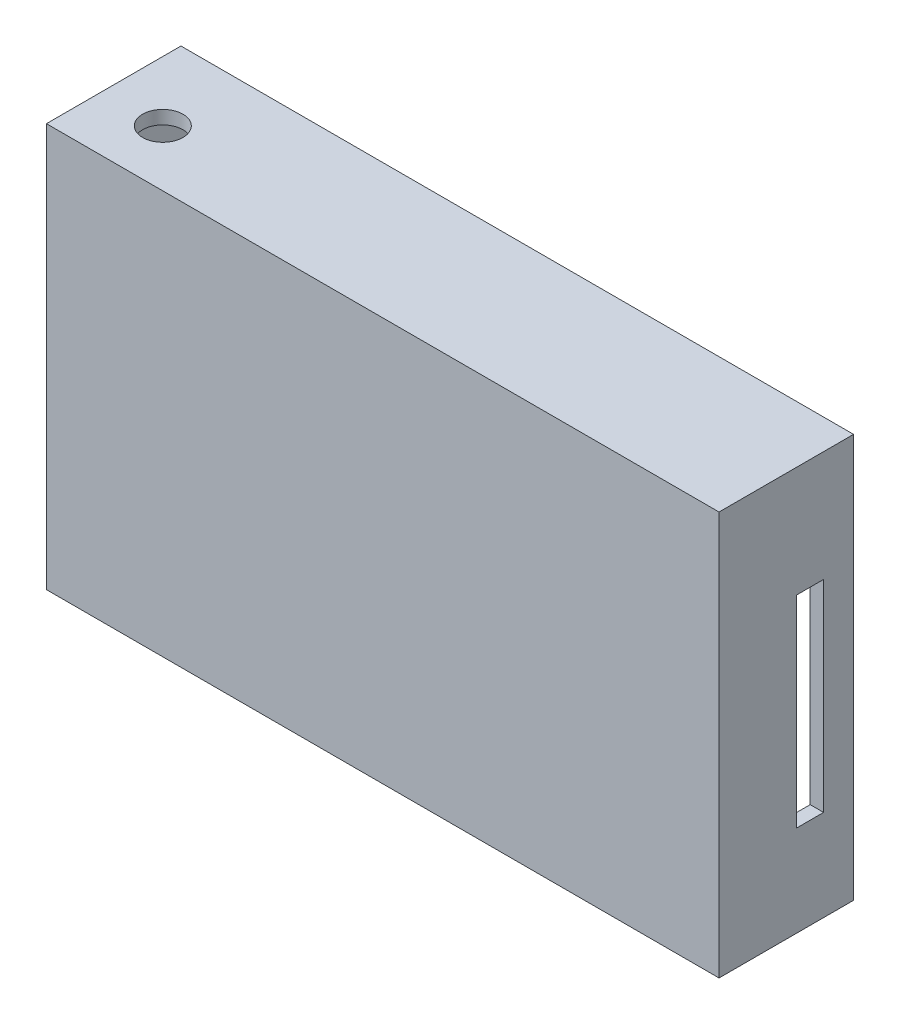
ISO-10303-21;
HEADER;
FILE_DESCRIPTION(('STEP AP214'),'2;1');
FILE_NAME('part.step','',(''),(''),'','','');
FILE_SCHEMA(('AUTOMOTIVE_DESIGN { 1 0 10303 214 1 1 1 1 }'));
ENDSEC;
DATA;
#1=APPLICATION_CONTEXT('core data for automotive mechanical design processes');
#2=APPLICATION_PROTOCOL_DEFINITION('international standard','automotive_design',2000,#1);
#3=PRODUCT_CONTEXT('',#1,'mechanical');
#4=PRODUCT('Part','Part','',(#3));
#5=PRODUCT_RELATED_PRODUCT_CATEGORY('part','',(#4));
#6=PRODUCT_DEFINITION_FORMATION('','',#4);
#7=PRODUCT_DEFINITION_CONTEXT('part definition',#1,'design');
#8=PRODUCT_DEFINITION('design','',#6,#7);
#9=PRODUCT_DEFINITION_SHAPE('','',#8);
#10=(LENGTH_UNIT() NAMED_UNIT(*) SI_UNIT(.MILLI.,.METRE.));
#11=(NAMED_UNIT(*) PLANE_ANGLE_UNIT() SI_UNIT($,.RADIAN.));
#12=(NAMED_UNIT(*) SI_UNIT($,.STERADIAN.) SOLID_ANGLE_UNIT());
#13=UNCERTAINTY_MEASURE_WITH_UNIT(LENGTH_MEASURE(1.E-05),#10,'distance_accuracy_value','');
#14=(GEOMETRIC_REPRESENTATION_CONTEXT(3) GLOBAL_UNCERTAINTY_ASSIGNED_CONTEXT((#13)) GLOBAL_UNIT_ASSIGNED_CONTEXT((#10,
#11,#12)) REPRESENTATION_CONTEXT('',''));
#15=CARTESIAN_POINT('',(0.,0.,0.));
#16=DIRECTION('',(0.,0.,1.));
#17=DIRECTION('',(1.,0.,0.));
#18=AXIS2_PLACEMENT_3D('',#15,#16,#17);
#19=CARTESIAN_POINT('',(25.,15.,10.));
#20=DIRECTION('',(-1.,0.,0.));
#21=DIRECTION('',(0.,0.,1.));
#22=AXIS2_PLACEMENT_3D('',#19,#20,#21);
#23=PLANE('',#22);
#24=DIRECTION('',(0.,0.,-1.));
#25=VECTOR('',#24,1.);
#26=CARTESIAN_POINT('',(25.,6.77303773797888,10.));
#27=LINE('',#26,#25);
#28=CARTESIAN_POINT('',(25.,6.77303773797888,4.22599338687957));
#29=VERTEX_POINT('',#28);
#30=CARTESIAN_POINT('',(25.,6.77303773797888,2.22599338687957));
#31=VERTEX_POINT('',#30);
#32=EDGE_CURVE('E189',#29,#31,#27,.T.);
#33=ORIENTED_EDGE('',*,*,#32,.T.);
#34=DIRECTION('',(0.,-1.,0.));
#35=VECTOR('',#34,1.);
#36=CARTESIAN_POINT('',(25.,15.,2.22599338687957));
#37=LINE('',#36,#35);
#38=CARTESIAN_POINT('',(25.,-8.22696226202112,2.22599338687956));
#39=VERTEX_POINT('',#38);
#40=EDGE_CURVE('E205',#31,#39,#37,.T.);
#41=ORIENTED_EDGE('',*,*,#40,.T.);
#42=DIRECTION('',(0.,0.,1.));
#43=VECTOR('',#42,1.);
#44=CARTESIAN_POINT('',(25.,-8.22696226202112,10.));
#45=LINE('',#44,#43);
#46=CARTESIAN_POINT('',(25.,-8.22696226202112,4.22599338687956));
#47=VERTEX_POINT('',#46);
#48=EDGE_CURVE('E200',#39,#47,#45,.T.);
#49=ORIENTED_EDGE('',*,*,#48,.T.);
#50=DIRECTION('',(0.,1.,0.));
#51=VECTOR('',#50,1.);
#52=CARTESIAN_POINT('',(25.,15.,4.22599338687957));
#53=LINE('',#52,#51);
#54=EDGE_CURVE('E195',#47,#29,#53,.T.);
#55=ORIENTED_EDGE('',*,*,#54,.T.);
#56=EDGE_LOOP('',(#33,#41,#49,#55));
#57=FACE_BOUND('',#56,.T.);
#58=DIRECTION('',(0.,1.,0.));
#59=VECTOR('',#58,1.);
#60=CARTESIAN_POINT('',(25.,15.,0.));
#61=LINE('',#60,#59);
#62=CARTESIAN_POINT('',(25.,-15.,0.));
#63=VERTEX_POINT('',#62);
#64=CARTESIAN_POINT('',(25.,15.,0.));
#65=VERTEX_POINT('',#64);
#66=EDGE_CURVE('E212',#63,#65,#61,.T.);
#67=ORIENTED_EDGE('',*,*,#66,.T.);
#68=DIRECTION('',(0.,0.,-1.));
#69=VECTOR('',#68,1.);
#70=CARTESIAN_POINT('',(25.,15.,10.));
#71=LINE('',#70,#69);
#72=CARTESIAN_POINT('',(25.,15.,10.));
#73=VERTEX_POINT('',#72);
#74=EDGE_CURVE('E266',#73,#65,#71,.T.);
#75=ORIENTED_EDGE('',*,*,#74,.F.);
#76=DIRECTION('',(0.,1.,0.));
#77=VECTOR('',#76,1.);
#78=CARTESIAN_POINT('',(25.,15.,10.));
#79=LINE('',#78,#77);
#80=CARTESIAN_POINT('',(25.,-15.,10.));
#81=VERTEX_POINT('',#80);
#82=EDGE_CURVE('E240',#81,#73,#79,.T.);
#83=ORIENTED_EDGE('',*,*,#82,.F.);
#84=DIRECTION('',(0.,0.,-1.));
#85=VECTOR('',#84,1.);
#86=CARTESIAN_POINT('',(25.,-15.,10.));
#87=LINE('',#86,#85);
#88=EDGE_CURVE('E250',#81,#63,#87,.T.);
#89=ORIENTED_EDGE('',*,*,#88,.T.);
#90=EDGE_LOOP('',(#67,#75,#83,#89));
#91=FACE_BOUND('',#90,.T.);
#92=ADVANCED_FACE('F37',(#57,#91),#23,.F.);
#93=CARTESIAN_POINT('',(-25.,15.,10.));
#94=DIRECTION('',(0.,-1.,0.));
#95=DIRECTION('',(0.,0.,-1.));
#96=AXIS2_PLACEMENT_3D('',#93,#94,#95);
#97=PLANE('',#96);
#98=CARTESIAN_POINT('',(-20.5348885491573,15.,5.81535586886346));
#99=DIRECTION('',(0.,-1.,0.));
#100=DIRECTION('',(0.,0.,-1.));
#101=AXIS2_PLACEMENT_3D('',#98,#99,#100);
#102=CIRCLE('',#101,1.5);
#103=CARTESIAN_POINT('',(-20.5348885491573,15.,4.31535586886346));
#104=VERTEX_POINT('',#103);
#105=EDGE_CURVE('E172',#104,#104,#102,.T.);
#106=ORIENTED_EDGE('',*,*,#105,.T.);
#107=EDGE_LOOP('',(#106));
#108=FACE_BOUND('',#107,.T.);
#109=DIRECTION('',(-1.,0.,0.));
#110=VECTOR('',#109,1.);
#111=CARTESIAN_POINT('',(-25.,15.,0.));
#112=LINE('',#111,#110);
#113=CARTESIAN_POINT('',(-25.,15.,0.));
#114=VERTEX_POINT('',#113);
#115=EDGE_CURVE('E253',#65,#114,#112,.T.);
#116=ORIENTED_EDGE('',*,*,#115,.T.);
#117=DIRECTION('',(0.,0.,-1.));
#118=VECTOR('',#117,1.);
#119=CARTESIAN_POINT('',(-25.,15.,10.));
#120=LINE('',#119,#118);
#121=CARTESIAN_POINT('',(-25.,15.,10.));
#122=VERTEX_POINT('',#121);
#123=EDGE_CURVE('E263',#122,#114,#120,.T.);
#124=ORIENTED_EDGE('',*,*,#123,.F.);
#125=DIRECTION('',(-1.,0.,0.));
#126=VECTOR('',#125,1.);
#127=CARTESIAN_POINT('',(-25.,15.,10.));
#128=LINE('',#127,#126);
#129=EDGE_CURVE('E243',#73,#122,#128,.T.);
#130=ORIENTED_EDGE('',*,*,#129,.F.);
#131=ORIENTED_EDGE('',*,*,#74,.T.);
#132=EDGE_LOOP('',(#116,#124,#130,#131));
#133=FACE_BOUND('',#132,.T.);
#134=ADVANCED_FACE('F296',(#108,#133),#97,.F.);
#135=CARTESIAN_POINT('',(-25.,15.,10.));
#136=DIRECTION('',(1.,0.,0.));
#137=DIRECTION('',(0.,1.,0.));
#138=AXIS2_PLACEMENT_3D('',#135,#136,#137);
#139=PLANE('',#138);
#140=DIRECTION('',(0.,0.,-1.));
#141=VECTOR('',#140,1.);
#142=CARTESIAN_POINT('',(-25.,-8.22696226202112,4.22599338687956));
#143=LINE('',#142,#141);
#144=CARTESIAN_POINT('',(-25.,-8.22696226202112,4.22599338687956));
#145=VERTEX_POINT('',#144);
#146=CARTESIAN_POINT('',(-25.,-8.22696226202112,2.22599338687956));
#147=VERTEX_POINT('',#146);
#148=EDGE_CURVE('E171',#145,#147,#143,.T.);
#149=ORIENTED_EDGE('',*,*,#148,.T.);
#150=DIRECTION('',(0.,1.,0.));
#151=VECTOR('',#150,1.);
#152=CARTESIAN_POINT('',(-25.,6.77303773797888,2.22599338687957));
#153=LINE('',#152,#151);
#154=CARTESIAN_POINT('',(-25.,6.77303773797888,2.22599338687957));
#155=VERTEX_POINT('',#154);
#156=EDGE_CURVE('E155',#147,#155,#153,.T.);
#157=ORIENTED_EDGE('',*,*,#156,.T.);
#158=DIRECTION('',(0.,0.,1.));
#159=VECTOR('',#158,1.);
#160=CARTESIAN_POINT('',(-25.,6.77303773797888,4.22599338687957));
#161=LINE('',#160,#159);
#162=CARTESIAN_POINT('',(-25.,6.77303773797888,4.22599338687957));
#163=VERTEX_POINT('',#162);
#164=EDGE_CURVE('E163',#155,#163,#161,.T.);
#165=ORIENTED_EDGE('',*,*,#164,.T.);
#166=DIRECTION('',(0.,-1.,0.));
#167=VECTOR('',#166,1.);
#168=CARTESIAN_POINT('',(-25.,6.77303773797888,4.22599338687957));
#169=LINE('',#168,#167);
#170=EDGE_CURVE('E60',#163,#145,#169,.T.);
#171=ORIENTED_EDGE('',*,*,#170,.T.);
#172=EDGE_LOOP('',(#149,#157,#165,#171));
#173=FACE_BOUND('',#172,.T.);
#174=DIRECTION('',(0.,-1.,0.));
#175=VECTOR('',#174,1.);
#176=CARTESIAN_POINT('',(-25.,15.,0.));
#177=LINE('',#176,#175);
#178=CARTESIAN_POINT('',(-25.,-15.,0.));
#179=VERTEX_POINT('',#178);
#180=EDGE_CURVE('E255',#114,#179,#177,.T.);
#181=ORIENTED_EDGE('',*,*,#180,.T.);
#182=DIRECTION('',(0.,0.,-1.));
#183=VECTOR('',#182,1.);
#184=CARTESIAN_POINT('',(-25.,-15.,10.));
#185=LINE('',#184,#183);
#186=CARTESIAN_POINT('',(-25.,-15.,10.));
#187=VERTEX_POINT('',#186);
#188=EDGE_CURVE('E260',#187,#179,#185,.T.);
#189=ORIENTED_EDGE('',*,*,#188,.F.);
#190=DIRECTION('',(0.,-1.,0.));
#191=VECTOR('',#190,1.);
#192=CARTESIAN_POINT('',(-25.,15.,10.));
#193=LINE('',#192,#191);
#194=EDGE_CURVE('E246',#122,#187,#193,.T.);
#195=ORIENTED_EDGE('',*,*,#194,.F.);
#196=ORIENTED_EDGE('',*,*,#123,.T.);
#197=EDGE_LOOP('',(#181,#189,#195,#196));
#198=FACE_BOUND('',#197,.T.);
#199=ADVANCED_FACE('F168',(#173,#198),#139,.F.);
#200=CARTESIAN_POINT('',(-25.,-15.,10.));
#201=DIRECTION('',(0.,1.,0.));
#202=DIRECTION('',(0.,0.,1.));
#203=AXIS2_PLACEMENT_3D('',#200,#201,#202);
#204=PLANE('',#203);
#205=DIRECTION('',(1.,0.,0.));
#206=VECTOR('',#205,1.);
#207=CARTESIAN_POINT('',(-25.,-15.,0.));
#208=LINE('',#207,#206);
#209=EDGE_CURVE('E244',#179,#63,#208,.T.);
#210=ORIENTED_EDGE('',*,*,#209,.T.);
#211=ORIENTED_EDGE('',*,*,#88,.F.);
#212=DIRECTION('',(1.,0.,0.));
#213=VECTOR('',#212,1.);
#214=CARTESIAN_POINT('',(-25.,-15.,10.));
#215=LINE('',#214,#213);
#216=EDGE_CURVE('E248',#187,#81,#215,.T.);
#217=ORIENTED_EDGE('',*,*,#216,.F.);
#218=ORIENTED_EDGE('',*,*,#188,.T.);
#219=EDGE_LOOP('',(#210,#211,#217,#218));
#220=FACE_BOUND('',#219,.T.);
#221=ADVANCED_FACE('F319',(#220),#204,.F.);
#222=CARTESIAN_POINT('',(0.,0.,10.));
#223=DIRECTION('',(0.,0.,1.));
#224=DIRECTION('',(1.,0.,0.));
#225=AXIS2_PLACEMENT_3D('',#222,#223,#224);
#226=PLANE('',#225);
#227=ORIENTED_EDGE('',*,*,#82,.T.);
#228=ORIENTED_EDGE('',*,*,#129,.T.);
#229=ORIENTED_EDGE('',*,*,#194,.T.);
#230=ORIENTED_EDGE('',*,*,#216,.T.);
#231=EDGE_LOOP('',(#227,#228,#229,#230));
#232=FACE_BOUND('',#231,.T.);
#233=ADVANCED_FACE('F315',(#232),#226,.T.);
#234=CARTESIAN_POINT('',(0.,0.,0.));
#235=DIRECTION('',(0.,0.,1.));
#236=DIRECTION('',(1.,0.,0.));
#237=AXIS2_PLACEMENT_3D('',#234,#235,#236);
#238=PLANE('',#237);
#239=DIRECTION('',(1.,0.,0.));
#240=VECTOR('',#239,1.);
#241=CARTESIAN_POINT('',(-25.,-14.,0.));
#242=LINE('',#241,#240);
#243=CARTESIAN_POINT('',(-24.,-14.,0.));
#244=VERTEX_POINT('',#243);
#245=CARTESIAN_POINT('',(24.,-14.,0.));
#246=VERTEX_POINT('',#245);
#247=EDGE_CURVE('E218',#244,#246,#242,.T.);
#248=ORIENTED_EDGE('',*,*,#247,.T.);
#249=DIRECTION('',(0.,1.,0.));
#250=VECTOR('',#249,1.);
#251=CARTESIAN_POINT('',(24.,15.,0.));
#252=LINE('',#251,#250);
#253=CARTESIAN_POINT('',(24.,14.,0.));
#254=VERTEX_POINT('',#253);
#255=EDGE_CURVE('E208',#246,#254,#252,.T.);
#256=ORIENTED_EDGE('',*,*,#255,.T.);
#257=DIRECTION('',(-1.,0.,0.));
#258=VECTOR('',#257,1.);
#259=CARTESIAN_POINT('',(-25.,14.,0.));
#260=LINE('',#259,#258);
#261=CARTESIAN_POINT('',(-24.,14.,0.));
#262=VERTEX_POINT('',#261);
#263=EDGE_CURVE('E232',#254,#262,#260,.T.);
#264=ORIENTED_EDGE('',*,*,#263,.T.);
#265=DIRECTION('',(0.,-1.,0.));
#266=VECTOR('',#265,1.);
#267=CARTESIAN_POINT('',(-24.,15.,0.));
#268=LINE('',#267,#266);
#269=EDGE_CURVE('E235',#262,#244,#268,.T.);
#270=ORIENTED_EDGE('',*,*,#269,.T.);
#271=EDGE_LOOP('',(#248,#256,#264,#270));
#272=FACE_BOUND('',#271,.T.);
#273=ORIENTED_EDGE('',*,*,#66,.F.);
#274=ORIENTED_EDGE('',*,*,#209,.F.);
#275=ORIENTED_EDGE('',*,*,#180,.F.);
#276=ORIENTED_EDGE('',*,*,#115,.F.);
#277=EDGE_LOOP('',(#273,#274,#275,#276));
#278=FACE_BOUND('',#277,.T.);
#279=ADVANCED_FACE('F309',(#272,#278),#238,.F.);
#280=CARTESIAN_POINT('',(24.,15.,10.));
#281=DIRECTION('',(-1.,0.,0.));
#282=DIRECTION('',(0.,0.,1.));
#283=AXIS2_PLACEMENT_3D('',#280,#281,#282);
#284=PLANE('',#283);
#285=DIRECTION('',(0.,-1.,0.));
#286=VECTOR('',#285,1.);
#287=CARTESIAN_POINT('',(24.,15.,2.22599338687957));
#288=LINE('',#287,#286);
#289=CARTESIAN_POINT('',(24.,6.77303773797888,2.22599338687957));
#290=VERTEX_POINT('',#289);
#291=CARTESIAN_POINT('',(24.,-8.22696226202112,2.22599338687956));
#292=VERTEX_POINT('',#291);
#293=EDGE_CURVE('E203',#290,#292,#288,.T.);
#294=ORIENTED_EDGE('',*,*,#293,.F.);
#295=DIRECTION('',(0.,0.,-1.));
#296=VECTOR('',#295,1.);
#297=CARTESIAN_POINT('',(24.,6.77303773797888,10.));
#298=LINE('',#297,#296);
#299=CARTESIAN_POINT('',(24.,6.77303773797888,4.22599338687957));
#300=VERTEX_POINT('',#299);
#301=EDGE_CURVE('E181',#300,#290,#298,.T.);
#302=ORIENTED_EDGE('',*,*,#301,.F.);
#303=DIRECTION('',(0.,1.,0.));
#304=VECTOR('',#303,1.);
#305=CARTESIAN_POINT('',(24.,15.,4.22599338687957));
#306=LINE('',#305,#304);
#307=CARTESIAN_POINT('',(24.,-8.22696226202112,4.22599338687956));
#308=VERTEX_POINT('',#307);
#309=EDGE_CURVE('E192',#308,#300,#306,.T.);
#310=ORIENTED_EDGE('',*,*,#309,.F.);
#311=DIRECTION('',(0.,0.,1.));
#312=VECTOR('',#311,1.);
#313=CARTESIAN_POINT('',(24.,-8.22696226202112,10.));
#314=LINE('',#313,#312);
#315=EDGE_CURVE('E198',#292,#308,#314,.T.);
#316=ORIENTED_EDGE('',*,*,#315,.F.);
#317=EDGE_LOOP('',(#294,#302,#310,#316));
#318=FACE_BOUND('',#317,.T.);
#319=ORIENTED_EDGE('',*,*,#255,.F.);
#320=DIRECTION('',(0.,0.,-1.));
#321=VECTOR('',#320,1.);
#322=CARTESIAN_POINT('',(24.,-14.,10.));
#323=LINE('',#322,#321);
#324=CARTESIAN_POINT('',(24.,-14.,9.));
#325=VERTEX_POINT('',#324);
#326=EDGE_CURVE('E219',#325,#246,#323,.T.);
#327=ORIENTED_EDGE('',*,*,#326,.F.);
#328=DIRECTION('',(0.,1.,0.));
#329=VECTOR('',#328,1.);
#330=CARTESIAN_POINT('',(24.,15.,9.));
#331=LINE('',#330,#329);
#332=CARTESIAN_POINT('',(24.,14.,9.));
#333=VERTEX_POINT('',#332);
#334=EDGE_CURVE('E214',#325,#333,#331,.T.);
#335=ORIENTED_EDGE('',*,*,#334,.T.);
#336=DIRECTION('',(0.,0.,-1.));
#337=VECTOR('',#336,1.);
#338=CARTESIAN_POINT('',(24.,14.,10.));
#339=LINE('',#338,#337);
#340=EDGE_CURVE('E209',#333,#254,#339,.T.);
#341=ORIENTED_EDGE('',*,*,#340,.T.);
#342=EDGE_LOOP('',(#319,#327,#335,#341));
#343=FACE_BOUND('',#342,.T.);
#344=ADVANCED_FACE('F329',(#318,#343),#284,.T.);
#345=CARTESIAN_POINT('',(-25.,14.,10.));
#346=DIRECTION('',(0.,-1.,0.));
#347=DIRECTION('',(0.,0.,-1.));
#348=AXIS2_PLACEMENT_3D('',#345,#346,#347);
#349=PLANE('',#348);
#350=CARTESIAN_POINT('',(-20.5348885491573,14.,5.81535586886346));
#351=DIRECTION('',(0.,-1.,0.));
#352=DIRECTION('',(0.,0.,-1.));
#353=AXIS2_PLACEMENT_3D('',#350,#351,#352);
#354=CIRCLE('',#353,1.5);
#355=CARTESIAN_POINT('',(-20.5348885491573,14.,4.31535586886346));
#356=VERTEX_POINT('',#355);
#357=EDGE_CURVE('E40',#356,#356,#354,.T.);
#358=ORIENTED_EDGE('',*,*,#357,.F.);
#359=EDGE_LOOP('',(#358));
#360=FACE_BOUND('',#359,.T.);
#361=ORIENTED_EDGE('',*,*,#263,.F.);
#362=ORIENTED_EDGE('',*,*,#340,.F.);
#363=DIRECTION('',(-1.,0.,0.));
#364=VECTOR('',#363,1.);
#365=CARTESIAN_POINT('',(-25.,14.,9.));
#366=LINE('',#365,#364);
#367=CARTESIAN_POINT('',(-24.,14.,9.));
#368=VERTEX_POINT('',#367);
#369=EDGE_CURVE('E217',#333,#368,#366,.T.);
#370=ORIENTED_EDGE('',*,*,#369,.T.);
#371=DIRECTION('',(0.,0.,-1.));
#372=VECTOR('',#371,1.);
#373=CARTESIAN_POINT('',(-24.,14.,10.));
#374=LINE('',#373,#372);
#375=EDGE_CURVE('E213',#368,#262,#374,.T.);
#376=ORIENTED_EDGE('',*,*,#375,.T.);
#377=EDGE_LOOP('',(#361,#362,#370,#376));
#378=FACE_BOUND('',#377,.T.);
#379=ADVANCED_FACE('F342',(#360,#378),#349,.T.);
#380=CARTESIAN_POINT('',(-24.,15.,10.));
#381=DIRECTION('',(1.,0.,0.));
#382=DIRECTION('',(0.,1.,0.));
#383=AXIS2_PLACEMENT_3D('',#380,#381,#382);
#384=PLANE('',#383);
#385=DIRECTION('',(0.,1.,0.));
#386=VECTOR('',#385,1.);
#387=CARTESIAN_POINT('',(-24.,15.,2.22599338687957));
#388=LINE('',#387,#386);
#389=CARTESIAN_POINT('',(-24.,-8.22696226202112,2.22599338687956));
#390=VERTEX_POINT('',#389);
#391=CARTESIAN_POINT('',(-24.,6.77303773797888,2.22599338687957));
#392=VERTEX_POINT('',#391);
#393=EDGE_CURVE('E11',#390,#392,#388,.T.);
#394=ORIENTED_EDGE('',*,*,#393,.F.);
#395=DIRECTION('',(0.,0.,-1.));
#396=VECTOR('',#395,1.);
#397=CARTESIAN_POINT('',(-24.,-8.22696226202112,10.));
#398=LINE('',#397,#396);
#399=CARTESIAN_POINT('',(-24.,-8.22696226202112,4.22599338687956));
#400=VERTEX_POINT('',#399);
#401=EDGE_CURVE('E45',#400,#390,#398,.T.);
#402=ORIENTED_EDGE('',*,*,#401,.F.);
#403=DIRECTION('',(0.,-1.,0.));
#404=VECTOR('',#403,1.);
#405=CARTESIAN_POINT('',(-24.,15.,4.22599338687957));
#406=LINE('',#405,#404);
#407=CARTESIAN_POINT('',(-24.,6.77303773797888,4.22599338687957));
#408=VERTEX_POINT('',#407);
#409=EDGE_CURVE('E271',#408,#400,#406,.T.);
#410=ORIENTED_EDGE('',*,*,#409,.F.);
#411=DIRECTION('',(0.,0.,1.));
#412=VECTOR('',#411,1.);
#413=CARTESIAN_POINT('',(-24.,6.77303773797888,10.));
#414=LINE('',#413,#412);
#415=EDGE_CURVE('E269',#392,#408,#414,.T.);
#416=ORIENTED_EDGE('',*,*,#415,.F.);
#417=EDGE_LOOP('',(#394,#402,#410,#416));
#418=FACE_BOUND('',#417,.T.);
#419=ORIENTED_EDGE('',*,*,#269,.F.);
#420=ORIENTED_EDGE('',*,*,#375,.F.);
#421=DIRECTION('',(0.,-1.,0.));
#422=VECTOR('',#421,1.);
#423=CARTESIAN_POINT('',(-24.,15.,9.));
#424=LINE('',#423,#422);
#425=CARTESIAN_POINT('',(-24.,-14.,9.));
#426=VERTEX_POINT('',#425);
#427=EDGE_CURVE('E226',#368,#426,#424,.T.);
#428=ORIENTED_EDGE('',*,*,#427,.T.);
#429=DIRECTION('',(0.,0.,-1.));
#430=VECTOR('',#429,1.);
#431=CARTESIAN_POINT('',(-24.,-14.,10.));
#432=LINE('',#431,#430);
#433=EDGE_CURVE('E221',#426,#244,#432,.T.);
#434=ORIENTED_EDGE('',*,*,#433,.T.);
#435=EDGE_LOOP('',(#419,#420,#428,#434));
#436=FACE_BOUND('',#435,.T.);
#437=ADVANCED_FACE('F278',(#418,#436),#384,.T.);
#438=CARTESIAN_POINT('',(-25.,-14.,10.));
#439=DIRECTION('',(0.,1.,0.));
#440=DIRECTION('',(0.,0.,1.));
#441=AXIS2_PLACEMENT_3D('',#438,#439,#440);
#442=PLANE('',#441);
#443=ORIENTED_EDGE('',*,*,#247,.F.);
#444=ORIENTED_EDGE('',*,*,#433,.F.);
#445=DIRECTION('',(1.,0.,0.));
#446=VECTOR('',#445,1.);
#447=CARTESIAN_POINT('',(-25.,-14.,9.));
#448=LINE('',#447,#446);
#449=EDGE_CURVE('E222',#426,#325,#448,.T.);
#450=ORIENTED_EDGE('',*,*,#449,.T.);
#451=ORIENTED_EDGE('',*,*,#326,.T.);
#452=EDGE_LOOP('',(#443,#444,#450,#451));
#453=FACE_BOUND('',#452,.T.);
#454=ADVANCED_FACE('F335',(#453),#442,.T.);
#455=CARTESIAN_POINT('',(0.,0.,9.));
#456=DIRECTION('',(0.,0.,1.));
#457=DIRECTION('',(1.,0.,0.));
#458=AXIS2_PLACEMENT_3D('',#455,#456,#457);
#459=PLANE('',#458);
#460=ORIENTED_EDGE('',*,*,#334,.F.);
#461=ORIENTED_EDGE('',*,*,#449,.F.);
#462=ORIENTED_EDGE('',*,*,#427,.F.);
#463=ORIENTED_EDGE('',*,*,#369,.F.);
#464=EDGE_LOOP('',(#460,#461,#462,#463));
#465=FACE_BOUND('',#464,.T.);
#466=ADVANCED_FACE('F290',(#465),#459,.F.);
#467=CARTESIAN_POINT('',(-25.,6.77303773797888,4.22599338687957));
#468=DIRECTION('',(0.,1.,0.));
#469=DIRECTION('',(0.,0.,1.));
#470=AXIS2_PLACEMENT_3D('',#467,#468,#469);
#471=PLANE('',#470);
#472=ORIENTED_EDGE('',*,*,#415,.T.);
#473=DIRECTION('',(1.,0.,0.));
#474=VECTOR('',#473,1.);
#475=CARTESIAN_POINT('',(-25.,6.77303773797888,4.22599338687957));
#476=LINE('',#475,#474);
#477=EDGE_CURVE('E165',#163,#408,#476,.T.);
#478=ORIENTED_EDGE('',*,*,#477,.F.);
#479=ORIENTED_EDGE('',*,*,#164,.F.);
#480=DIRECTION('',(1.,0.,0.));
#481=VECTOR('',#480,1.);
#482=CARTESIAN_POINT('',(-25.,6.77303773797888,2.22599338687957));
#483=LINE('',#482,#481);
#484=EDGE_CURVE('E150',#155,#392,#483,.T.);
#485=ORIENTED_EDGE('',*,*,#484,.T.);
#486=EDGE_LOOP('',(#472,#478,#479,#485));
#487=FACE_BOUND('',#486,.T.);
#488=ADVANCED_FACE('F164',(#487),#471,.F.);
#489=CARTESIAN_POINT('',(-25.,6.77303773797888,4.22599338687957));
#490=DIRECTION('',(0.,0.,1.));
#491=DIRECTION('',(0.,-1.,0.));
#492=AXIS2_PLACEMENT_3D('',#489,#490,#491);
#493=PLANE('',#492);
#494=ORIENTED_EDGE('',*,*,#409,.T.);
#495=DIRECTION('',(1.,0.,0.));
#496=VECTOR('',#495,1.);
#497=CARTESIAN_POINT('',(-25.,-8.22696226202112,4.22599338687956));
#498=LINE('',#497,#496);
#499=EDGE_CURVE('E183',#145,#400,#498,.T.);
#500=ORIENTED_EDGE('',*,*,#499,.F.);
#501=ORIENTED_EDGE('',*,*,#170,.F.);
#502=ORIENTED_EDGE('',*,*,#477,.T.);
#503=EDGE_LOOP('',(#494,#500,#501,#502));
#504=FACE_BOUND('',#503,.T.);
#505=ADVANCED_FACE('F280',(#504),#493,.F.);
#506=CARTESIAN_POINT('',(-25.,-8.22696226202112,4.22599338687956));
#507=DIRECTION('',(0.,-1.,0.));
#508=DIRECTION('',(0.,0.,-1.));
#509=AXIS2_PLACEMENT_3D('',#506,#507,#508);
#510=PLANE('',#509);
#511=ORIENTED_EDGE('',*,*,#401,.T.);
#512=DIRECTION('',(1.,0.,0.));
#513=VECTOR('',#512,1.);
#514=CARTESIAN_POINT('',(-25.,-8.22696226202112,2.22599338687956));
#515=LINE('',#514,#513);
#516=EDGE_CURVE('E179',#147,#390,#515,.T.);
#517=ORIENTED_EDGE('',*,*,#516,.F.);
#518=ORIENTED_EDGE('',*,*,#148,.F.);
#519=ORIENTED_EDGE('',*,*,#499,.T.);
#520=EDGE_LOOP('',(#511,#517,#518,#519));
#521=FACE_BOUND('',#520,.T.);
#522=ADVANCED_FACE('F275',(#521),#510,.F.);
#523=CARTESIAN_POINT('',(-25.,6.77303773797888,2.22599338687957));
#524=DIRECTION('',(0.,0.,-1.));
#525=DIRECTION('',(0.,1.,0.));
#526=AXIS2_PLACEMENT_3D('',#523,#524,#525);
#527=PLANE('',#526);
#528=ORIENTED_EDGE('',*,*,#393,.T.);
#529=ORIENTED_EDGE('',*,*,#484,.F.);
#530=ORIENTED_EDGE('',*,*,#156,.F.);
#531=ORIENTED_EDGE('',*,*,#516,.T.);
#532=EDGE_LOOP('',(#528,#529,#530,#531));
#533=FACE_BOUND('',#532,.T.);
#534=ADVANCED_FACE('F152',(#533),#527,.F.);
#535=EDGE_CURVE('E52',#290,#31,#483,.T.);
#536=ORIENTED_EDGE('',*,*,#535,.F.);
#537=ORIENTED_EDGE('',*,*,#293,.T.);
#538=EDGE_CURVE('E182',#292,#39,#515,.T.);
#539=ORIENTED_EDGE('',*,*,#538,.T.);
#540=ORIENTED_EDGE('',*,*,#40,.F.);
#541=EDGE_LOOP('',(#536,#537,#539,#540));
#542=FACE_BOUND('',#541,.T.);
#543=ADVANCED_FACE('F350',(#542),#527,.F.);
#544=ORIENTED_EDGE('',*,*,#538,.F.);
#545=ORIENTED_EDGE('',*,*,#315,.T.);
#546=EDGE_CURVE('E186',#308,#47,#498,.T.);
#547=ORIENTED_EDGE('',*,*,#546,.T.);
#548=ORIENTED_EDGE('',*,*,#48,.F.);
#549=EDGE_LOOP('',(#544,#545,#547,#548));
#550=FACE_BOUND('',#549,.T.);
#551=ADVANCED_FACE('F289',(#550),#510,.F.);
#552=ORIENTED_EDGE('',*,*,#546,.F.);
#553=ORIENTED_EDGE('',*,*,#309,.T.);
#554=EDGE_CURVE('E160',#300,#29,#476,.T.);
#555=ORIENTED_EDGE('',*,*,#554,.T.);
#556=ORIENTED_EDGE('',*,*,#54,.F.);
#557=EDGE_LOOP('',(#552,#553,#555,#556));
#558=FACE_BOUND('',#557,.T.);
#559=ADVANCED_FACE('F283',(#558),#493,.F.);
#560=ORIENTED_EDGE('',*,*,#554,.F.);
#561=ORIENTED_EDGE('',*,*,#301,.T.);
#562=ORIENTED_EDGE('',*,*,#535,.T.);
#563=ORIENTED_EDGE('',*,*,#32,.F.);
#564=EDGE_LOOP('',(#560,#561,#562,#563));
#565=FACE_BOUND('',#564,.T.);
#566=ADVANCED_FACE('F292',(#565),#471,.F.);
#567=CARTESIAN_POINT('',(-20.5348885491573,4.,5.81535586886346));
#568=DIRECTION('',(0.,1.,0.));
#569=DIRECTION('',(0.,0.,1.));
#570=AXIS2_PLACEMENT_3D('',#567,#568,#569);
#571=CYLINDRICAL_SURFACE('',#570,1.5);
#572=ORIENTED_EDGE('',*,*,#357,.T.);
#573=EDGE_LOOP('',(#572));
#574=FACE_BOUND('',#573,.T.);
#575=ORIENTED_EDGE('',*,*,#105,.F.);
#576=EDGE_LOOP('',(#575));
#577=FACE_BOUND('',#576,.T.);
#578=ADVANCED_FACE('F370',(#574,#577),#571,.F.);
#579=CLOSED_SHELL('',(#92,#134,#199,#221,#233,#279,#344,#379,#437,#454,#466,#488,#505,#522,#534,
#543,#551,#559,#566,#578));
#580=MANIFOLD_SOLID_BREP('B2',#579);
#581=ADVANCED_BREP_SHAPE_REPRESENTATION('',(#18,#580),#14);
#582=SHAPE_DEFINITION_REPRESENTATION(#9,#581);
ENDSEC;
END-ISO-10303-21;
